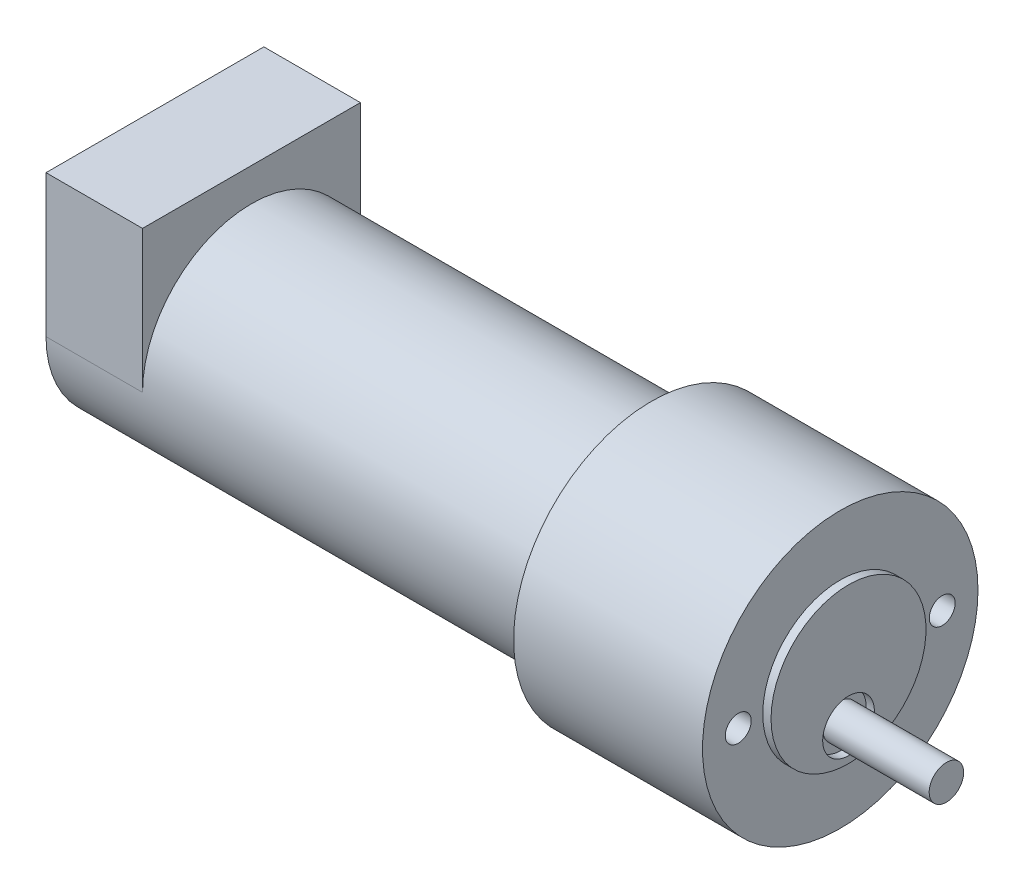
ISO-10303-21;
HEADER;
FILE_DESCRIPTION(('STEP AP214'),'2;1');
FILE_NAME('part.step','',(''),(''),'','','');
FILE_SCHEMA(('AUTOMOTIVE_DESIGN { 1 0 10303 214 1 1 1 1 }'));
ENDSEC;
DATA;
#1=APPLICATION_CONTEXT('core data for automotive mechanical design processes');
#2=APPLICATION_PROTOCOL_DEFINITION('international standard','automotive_design',2000,#1);
#3=PRODUCT_CONTEXT('',#1,'mechanical');
#4=PRODUCT('Part','Part','',(#3));
#5=PRODUCT_RELATED_PRODUCT_CATEGORY('part','',(#4));
#6=PRODUCT_DEFINITION_FORMATION('','',#4);
#7=PRODUCT_DEFINITION_CONTEXT('part definition',#1,'design');
#8=PRODUCT_DEFINITION('design','',#6,#7);
#9=PRODUCT_DEFINITION_SHAPE('','',#8);
#10=(LENGTH_UNIT() NAMED_UNIT(*) SI_UNIT(.MILLI.,.METRE.));
#11=(NAMED_UNIT(*) PLANE_ANGLE_UNIT() SI_UNIT($,.RADIAN.));
#12=(NAMED_UNIT(*) SI_UNIT($,.STERADIAN.) SOLID_ANGLE_UNIT());
#13=UNCERTAINTY_MEASURE_WITH_UNIT(LENGTH_MEASURE(1.E-05),#10,'distance_accuracy_value','');
#14=(GEOMETRIC_REPRESENTATION_CONTEXT(3) GLOBAL_UNCERTAINTY_ASSIGNED_CONTEXT((#13)) GLOBAL_UNIT_ASSIGNED_CONTEXT((#10,
#11,#12)) REPRESENTATION_CONTEXT('',''));
#15=CARTESIAN_POINT('',(0.,0.,0.));
#16=DIRECTION('',(0.,0.,1.));
#17=DIRECTION('',(1.,0.,0.));
#18=AXIS2_PLACEMENT_3D('',#15,#16,#17);
#19=CARTESIAN_POINT('',(126.238,0.,0.));
#20=DIRECTION('',(1.,0.,0.));
#21=DIRECTION('',(0.,0.,-1.));
#22=AXIS2_PLACEMENT_3D('',#19,#20,#21);
#23=PLANE('',#22);
#24=CARTESIAN_POINT('',(126.238,-8.2296,0.));
#25=DIRECTION('',(1.,0.,0.));
#26=DIRECTION('',(0.,0.,-1.));
#27=AXIS2_PLACEMENT_3D('',#24,#25,#26);
#28=CIRCLE('',#27,4.7625);
#29=CARTESIAN_POINT('',(126.238,-8.2296,4.7625));
#30=VERTEX_POINT('',#29);
#31=EDGE_CURVE('E11',#30,#30,#28,.F.);
#32=ORIENTED_EDGE('',*,*,#31,.F.);
#33=EDGE_LOOP('',(#32));
#34=FACE_BOUND('',#33,.T.);
#35=CARTESIAN_POINT('',(126.238,-8.2296,0.));
#36=DIRECTION('',(1.,0.,0.));
#37=DIRECTION('',(0.,0.,-1.));
#38=AXIS2_PLACEMENT_3D('',#35,#36,#37);
#39=CIRCLE('',#38,3.175);
#40=CARTESIAN_POINT('',(126.238,-8.2296,-3.175));
#41=VERTEX_POINT('',#40);
#42=EDGE_CURVE('E311',#41,#41,#39,.T.);
#43=ORIENTED_EDGE('',*,*,#42,.F.);
#44=EDGE_LOOP('',(#43));
#45=FACE_BOUND('',#44,.T.);
#46=ADVANCED_FACE('F32',(#34,#45),#23,.T.);
#47=CARTESIAN_POINT('',(126.238,0.,18.7833));
#48=DIRECTION('',(1.,0.,0.));
#49=DIRECTION('',(0.,0.,1.));
#50=AXIS2_PLACEMENT_3D('',#47,#48,#49);
#51=CIRCLE('',#50,2.3876);
#52=CARTESIAN_POINT('',(126.238,0.,21.1709));
#53=VERTEX_POINT('',#52);
#54=EDGE_CURVE('E302',#53,#53,#51,.T.);
#55=ORIENTED_EDGE('',*,*,#54,.F.);
#56=EDGE_LOOP('',(#55));
#57=FACE_BOUND('',#56,.T.);
#58=CARTESIAN_POINT('',(126.238,0.,-18.7833));
#59=DIRECTION('',(1.,0.,0.));
#60=DIRECTION('',(0.,0.,-1.));
#61=AXIS2_PLACEMENT_3D('',#58,#59,#60);
#62=CIRCLE('',#61,2.3876);
#63=CARTESIAN_POINT('',(126.238,0.,-21.1709));
#64=VERTEX_POINT('',#63);
#65=EDGE_CURVE('E301',#64,#64,#62,.T.);
#66=ORIENTED_EDGE('',*,*,#65,.F.);
#67=EDGE_LOOP('',(#66));
#68=FACE_BOUND('',#67,.T.);
#69=CARTESIAN_POINT('',(126.238,0.,0.));
#70=DIRECTION('',(1.,0.,0.));
#71=DIRECTION('',(0.,0.,-1.));
#72=AXIS2_PLACEMENT_3D('',#69,#70,#71);
#73=CIRCLE('',#72,25.3746);
#74=CARTESIAN_POINT('',(126.238,0.,-25.3746));
#75=VERTEX_POINT('',#74);
#76=EDGE_CURVE('E104',#75,#75,#73,.T.);
#77=ORIENTED_EDGE('',*,*,#76,.T.);
#78=EDGE_LOOP('',(#77));
#79=FACE_BOUND('',#78,.T.);
#80=CARTESIAN_POINT('',(126.238,0.,0.));
#81=DIRECTION('',(1.,0.,0.));
#82=DIRECTION('',(0.,0.,-1.));
#83=AXIS2_PLACEMENT_3D('',#80,#81,#82);
#84=CIRCLE('',#83,14.2748);
#85=CARTESIAN_POINT('',(126.238,0.,14.2748));
#86=VERTEX_POINT('',#85);
#87=EDGE_CURVE('E321',#86,#86,#84,.T.);
#88=ORIENTED_EDGE('',*,*,#87,.F.);
#89=EDGE_LOOP('',(#88));
#90=FACE_BOUND('',#89,.T.);
#91=ADVANCED_FACE('F125',(#57,#68,#79,#90),#23,.T.);
#92=CARTESIAN_POINT('',(91.44,0.,0.));
#93=DIRECTION('',(-1.,0.,0.));
#94=DIRECTION('',(0.,0.,1.));
#95=AXIS2_PLACEMENT_3D('',#92,#93,#94);
#96=CYLINDRICAL_SURFACE('',#95,20.066);
#97=CARTESIAN_POINT('',(17.78,0.,0.));
#98=DIRECTION('',(1.,0.,0.));
#99=DIRECTION('',(0.,0.,-1.));
#100=AXIS2_PLACEMENT_3D('',#97,#98,#99);
#101=CIRCLE('',#100,20.066);
#102=CARTESIAN_POINT('',(17.78,0.,-20.066));
#103=VERTEX_POINT('',#102);
#104=CARTESIAN_POINT('',(17.78,0.,20.066));
#105=VERTEX_POINT('',#104);
#106=EDGE_CURVE('E40',#103,#105,#101,.T.);
#107=ORIENTED_EDGE('',*,*,#106,.T.);
#108=DIRECTION('',(-1.,0.,0.));
#109=VECTOR('',#108,1.);
#110=CARTESIAN_POINT('',(17.78,0.,20.066));
#111=LINE('',#110,#109);
#112=CARTESIAN_POINT('',(0.,0.,20.066));
#113=VERTEX_POINT('',#112);
#114=EDGE_CURVE('E83',#105,#113,#111,.T.);
#115=ORIENTED_EDGE('',*,*,#114,.T.);
#116=CARTESIAN_POINT('',(0.,0.,0.));
#117=DIRECTION('',(1.,0.,0.));
#118=DIRECTION('',(0.,0.,-1.));
#119=AXIS2_PLACEMENT_3D('',#116,#117,#118);
#120=CIRCLE('',#119,20.066);
#121=CARTESIAN_POINT('',(0.,0.,-20.066));
#122=VERTEX_POINT('',#121);
#123=EDGE_CURVE('E107',#113,#122,#120,.T.);
#124=ORIENTED_EDGE('',*,*,#123,.T.);
#125=DIRECTION('',(-1.,0.,0.));
#126=VECTOR('',#125,1.);
#127=CARTESIAN_POINT('',(17.78,0.,-20.066));
#128=LINE('',#127,#126);
#129=EDGE_CURVE('E47',#103,#122,#128,.T.);
#130=ORIENTED_EDGE('',*,*,#129,.F.);
#131=EDGE_LOOP('',(#107,#115,#124,#130));
#132=FACE_BOUND('',#131,.T.);
#133=CARTESIAN_POINT('',(91.44,0.,0.));
#134=DIRECTION('',(1.,0.,0.));
#135=DIRECTION('',(0.,0.,-1.));
#136=AXIS2_PLACEMENT_3D('',#133,#134,#135);
#137=CIRCLE('',#136,20.066);
#138=CARTESIAN_POINT('',(91.44,0.,-20.066));
#139=VERTEX_POINT('',#138);
#140=EDGE_CURVE('E110',#139,#139,#137,.T.);
#141=ORIENTED_EDGE('',*,*,#140,.F.);
#142=EDGE_LOOP('',(#141));
#143=FACE_BOUND('',#142,.T.);
#144=ADVANCED_FACE('F34',(#132,#143),#96,.T.);
#145=CARTESIAN_POINT('',(0.,0.,0.));
#146=DIRECTION('',(1.,0.,0.));
#147=DIRECTION('',(0.,0.,-1.));
#148=AXIS2_PLACEMENT_3D('',#145,#146,#147);
#149=PLANE('',#148);
#150=ORIENTED_EDGE('',*,*,#123,.F.);
#151=DIRECTION('',(0.,1.,0.));
#152=VECTOR('',#151,1.);
#153=CARTESIAN_POINT('',(0.,26.162,20.066));
#154=LINE('',#153,#152);
#155=CARTESIAN_POINT('',(0.,26.162,20.066));
#156=VERTEX_POINT('',#155);
#157=EDGE_CURVE('E102',#113,#156,#154,.T.);
#158=ORIENTED_EDGE('',*,*,#157,.T.);
#159=DIRECTION('',(0.,0.,-1.));
#160=VECTOR('',#159,1.);
#161=CARTESIAN_POINT('',(0.,26.162,-20.066));
#162=LINE('',#161,#160);
#163=CARTESIAN_POINT('',(0.,26.162,-20.066));
#164=VERTEX_POINT('',#163);
#165=EDGE_CURVE('E77',#156,#164,#162,.T.);
#166=ORIENTED_EDGE('',*,*,#165,.T.);
#167=DIRECTION('',(0.,-1.,0.));
#168=VECTOR('',#167,1.);
#169=CARTESIAN_POINT('',(0.,26.162,-20.066));
#170=LINE('',#169,#168);
#171=EDGE_CURVE('E93',#164,#122,#170,.T.);
#172=ORIENTED_EDGE('',*,*,#171,.T.);
#173=EDGE_LOOP('',(#150,#158,#166,#172));
#174=FACE_BOUND('',#173,.T.);
#175=ADVANCED_FACE('F118',(#174),#149,.F.);
#176=CARTESIAN_POINT('',(17.78,0.,0.));
#177=DIRECTION('',(1.,0.,0.));
#178=DIRECTION('',(0.,0.,-1.));
#179=AXIS2_PLACEMENT_3D('',#176,#177,#178);
#180=PLANE('',#179);
#181=ORIENTED_EDGE('',*,*,#106,.F.);
#182=DIRECTION('',(0.,-1.,0.));
#183=VECTOR('',#182,1.);
#184=CARTESIAN_POINT('',(17.78,26.162,-20.066));
#185=LINE('',#184,#183);
#186=CARTESIAN_POINT('',(17.78,26.162,-20.066));
#187=VERTEX_POINT('',#186);
#188=EDGE_CURVE('E90',#187,#103,#185,.T.);
#189=ORIENTED_EDGE('',*,*,#188,.F.);
#190=DIRECTION('',(0.,0.,-1.));
#191=VECTOR('',#190,1.);
#192=CARTESIAN_POINT('',(17.78,26.162,-20.066));
#193=LINE('',#192,#191);
#194=CARTESIAN_POINT('',(17.78,26.162,20.066));
#195=VERTEX_POINT('',#194);
#196=EDGE_CURVE('E74',#195,#187,#193,.T.);
#197=ORIENTED_EDGE('',*,*,#196,.F.);
#198=DIRECTION('',(0.,1.,0.));
#199=VECTOR('',#198,1.);
#200=CARTESIAN_POINT('',(17.78,26.162,20.066));
#201=LINE('',#200,#199);
#202=EDGE_CURVE('E88',#105,#195,#201,.T.);
#203=ORIENTED_EDGE('',*,*,#202,.F.);
#204=EDGE_LOOP('',(#181,#189,#197,#203));
#205=FACE_BOUND('',#204,.T.);
#206=ADVANCED_FACE('F87',(#205),#180,.T.);
#207=CARTESIAN_POINT('',(17.78,26.162,-20.066));
#208=DIRECTION('',(0.,0.,-1.));
#209=DIRECTION('',(-1.,0.,0.));
#210=AXIS2_PLACEMENT_3D('',#207,#208,#209);
#211=PLANE('',#210);
#212=ORIENTED_EDGE('',*,*,#171,.F.);
#213=DIRECTION('',(-1.,0.,0.));
#214=VECTOR('',#213,1.);
#215=CARTESIAN_POINT('',(17.78,26.162,-20.066));
#216=LINE('',#215,#214);
#217=EDGE_CURVE('E82',#187,#164,#216,.T.);
#218=ORIENTED_EDGE('',*,*,#217,.F.);
#219=ORIENTED_EDGE('',*,*,#188,.T.);
#220=ORIENTED_EDGE('',*,*,#129,.T.);
#221=EDGE_LOOP('',(#212,#218,#219,#220));
#222=FACE_BOUND('',#221,.T.);
#223=ADVANCED_FACE('F117',(#222),#211,.T.);
#224=CARTESIAN_POINT('',(17.78,26.162,-20.066));
#225=DIRECTION('',(0.,1.,0.));
#226=DIRECTION('',(0.,0.,1.));
#227=AXIS2_PLACEMENT_3D('',#224,#225,#226);
#228=PLANE('',#227);
#229=ORIENTED_EDGE('',*,*,#165,.F.);
#230=DIRECTION('',(-1.,0.,0.));
#231=VECTOR('',#230,1.);
#232=CARTESIAN_POINT('',(17.78,26.162,20.066));
#233=LINE('',#232,#231);
#234=EDGE_CURVE('E71',#195,#156,#233,.T.);
#235=ORIENTED_EDGE('',*,*,#234,.F.);
#236=ORIENTED_EDGE('',*,*,#196,.T.);
#237=ORIENTED_EDGE('',*,*,#217,.T.);
#238=EDGE_LOOP('',(#229,#235,#236,#237));
#239=FACE_BOUND('',#238,.T.);
#240=ADVANCED_FACE('F73',(#239),#228,.T.);
#241=CARTESIAN_POINT('',(17.78,26.162,20.066));
#242=DIRECTION('',(0.,0.,1.));
#243=DIRECTION('',(0.,-1.,0.));
#244=AXIS2_PLACEMENT_3D('',#241,#242,#243);
#245=PLANE('',#244);
#246=ORIENTED_EDGE('',*,*,#157,.F.);
#247=ORIENTED_EDGE('',*,*,#114,.F.);
#248=ORIENTED_EDGE('',*,*,#202,.T.);
#249=ORIENTED_EDGE('',*,*,#234,.T.);
#250=EDGE_LOOP('',(#246,#247,#248,#249));
#251=FACE_BOUND('',#250,.T.);
#252=ADVANCED_FACE('F92',(#251),#245,.T.);
#253=CARTESIAN_POINT('',(91.44,0.,0.));
#254=DIRECTION('',(1.,0.,0.));
#255=DIRECTION('',(0.,0.,-1.));
#256=AXIS2_PLACEMENT_3D('',#253,#254,#255);
#257=PLANE('',#256);
#258=CARTESIAN_POINT('',(91.44,0.,0.));
#259=DIRECTION('',(1.,0.,0.));
#260=DIRECTION('',(0.,0.,-1.));
#261=AXIS2_PLACEMENT_3D('',#258,#259,#260);
#262=CIRCLE('',#261,25.3746);
#263=CARTESIAN_POINT('',(91.44,0.,-25.3746));
#264=VERTEX_POINT('',#263);
#265=EDGE_CURVE('E98',#264,#264,#262,.T.);
#266=ORIENTED_EDGE('',*,*,#265,.F.);
#267=EDGE_LOOP('',(#266));
#268=FACE_BOUND('',#267,.T.);
#269=ORIENTED_EDGE('',*,*,#140,.T.);
#270=EDGE_LOOP('',(#269));
#271=FACE_BOUND('',#270,.T.);
#272=ADVANCED_FACE('F140',(#268,#271),#257,.F.);
#273=CARTESIAN_POINT('',(126.238,0.,0.));
#274=DIRECTION('',(-1.,0.,0.));
#275=DIRECTION('',(0.,0.,1.));
#276=AXIS2_PLACEMENT_3D('',#273,#274,#275);
#277=CYLINDRICAL_SURFACE('',#276,25.3746);
#278=ORIENTED_EDGE('',*,*,#76,.F.);
#279=EDGE_LOOP('',(#278));
#280=FACE_BOUND('',#279,.T.);
#281=ORIENTED_EDGE('',*,*,#265,.T.);
#282=EDGE_LOOP('',(#281));
#283=FACE_BOUND('',#282,.T.);
#284=ADVANCED_FACE('F143',(#280,#283),#277,.T.);
#285=CARTESIAN_POINT('',(127.762,0.,0.));
#286=DIRECTION('',(1.,0.,0.));
#287=DIRECTION('',(0.,0.,-1.));
#288=AXIS2_PLACEMENT_3D('',#285,#286,#287);
#289=PLANE('',#288);
#290=CARTESIAN_POINT('',(127.762,0.,0.));
#291=DIRECTION('',(1.,0.,0.));
#292=DIRECTION('',(0.,0.,-1.));
#293=AXIS2_PLACEMENT_3D('',#290,#291,#292);
#294=CIRCLE('',#293,14.2748);
#295=CARTESIAN_POINT('',(127.762,0.,14.2748));
#296=VERTEX_POINT('',#295);
#297=EDGE_CURVE('E322',#296,#296,#294,.T.);
#298=ORIENTED_EDGE('',*,*,#297,.T.);
#299=EDGE_LOOP('',(#298));
#300=FACE_BOUND('',#299,.T.);
#301=CARTESIAN_POINT('',(127.762,-8.2296,0.));
#302=DIRECTION('',(1.,0.,0.));
#303=DIRECTION('',(0.,0.,-1.));
#304=AXIS2_PLACEMENT_3D('',#301,#302,#303);
#305=CIRCLE('',#304,4.7625);
#306=CARTESIAN_POINT('',(127.762,-8.2296,4.7625));
#307=VERTEX_POINT('',#306);
#308=EDGE_CURVE('E316',#307,#307,#305,.T.);
#309=ORIENTED_EDGE('',*,*,#308,.F.);
#310=EDGE_LOOP('',(#309));
#311=FACE_BOUND('',#310,.T.);
#312=ADVANCED_FACE('F146',(#300,#311),#289,.T.);
#313=CARTESIAN_POINT('',(127.762,0.,0.));
#314=DIRECTION('',(-1.,0.,0.));
#315=DIRECTION('',(0.,0.,1.));
#316=AXIS2_PLACEMENT_3D('',#313,#314,#315);
#317=CYLINDRICAL_SURFACE('',#316,14.2748);
#318=CARTESIAN_POINT('',(127.762,0.,14.2748));
#319=CARTESIAN_POINT('',(127.746125,0.,14.2748));
#320=CARTESIAN_POINT('',(127.73025,0.,14.2748));
#321=CARTESIAN_POINT('',(127.6985,0.,14.2748));
#322=CARTESIAN_POINT('',(127.682625,0.,14.2748));
#323=CARTESIAN_POINT('',(127.650875,0.,14.2748));
#324=CARTESIAN_POINT('',(127.635,0.,14.2748));
#325=CARTESIAN_POINT('',(127.60325,0.,14.2748));
#326=CARTESIAN_POINT('',(127.587375,0.,14.2748));
#327=CARTESIAN_POINT('',(127.555625,0.,14.2748));
#328=CARTESIAN_POINT('',(127.53975,0.,14.2748));
#329=CARTESIAN_POINT('',(127.508,0.,14.2748));
#330=CARTESIAN_POINT('',(127.492125,0.,14.2748));
#331=CARTESIAN_POINT('',(127.460375,0.,14.2748));
#332=CARTESIAN_POINT('',(127.4445,0.,14.2748));
#333=CARTESIAN_POINT('',(127.41275,0.,14.2748));
#334=CARTESIAN_POINT('',(127.396875,0.,14.2748));
#335=CARTESIAN_POINT('',(127.365125,0.,14.2748));
#336=CARTESIAN_POINT('',(127.34925,0.,14.2748));
#337=CARTESIAN_POINT('',(127.3175,0.,14.2748));
#338=CARTESIAN_POINT('',(127.301625,0.,14.2748));
#339=CARTESIAN_POINT('',(127.269875,0.,14.2748));
#340=CARTESIAN_POINT('',(127.254,0.,14.2748));
#341=CARTESIAN_POINT('',(127.22225,0.,14.2748));
#342=CARTESIAN_POINT('',(127.206375,0.,14.2748));
#343=CARTESIAN_POINT('',(127.174625,0.,14.2748));
#344=CARTESIAN_POINT('',(127.15875,0.,14.2748));
#345=CARTESIAN_POINT('',(127.127,0.,14.2748));
#346=CARTESIAN_POINT('',(127.111125,0.,14.2748));
#347=CARTESIAN_POINT('',(127.079375,0.,14.2748));
#348=CARTESIAN_POINT('',(127.0635,0.,14.2748));
#349=CARTESIAN_POINT('',(127.03175,0.,14.2748));
#350=CARTESIAN_POINT('',(127.015875,0.,14.2748));
#351=CARTESIAN_POINT('',(126.984125,0.,14.2748));
#352=CARTESIAN_POINT('',(126.96825,0.,14.2748));
#353=CARTESIAN_POINT('',(126.9365,0.,14.2748));
#354=CARTESIAN_POINT('',(126.920625,0.,14.2748));
#355=CARTESIAN_POINT('',(126.888875,0.,14.2748));
#356=CARTESIAN_POINT('',(126.873,0.,14.2748));
#357=CARTESIAN_POINT('',(126.84125,0.,14.2748));
#358=CARTESIAN_POINT('',(126.825375,0.,14.2748));
#359=CARTESIAN_POINT('',(126.793625,0.,14.2748));
#360=CARTESIAN_POINT('',(126.77775,0.,14.2748));
#361=CARTESIAN_POINT('',(126.746,0.,14.2748));
#362=CARTESIAN_POINT('',(126.730125,0.,14.2748));
#363=CARTESIAN_POINT('',(126.698375,0.,14.2748));
#364=CARTESIAN_POINT('',(126.6825,0.,14.2748));
#365=CARTESIAN_POINT('',(126.65075,0.,14.2748));
#366=CARTESIAN_POINT('',(126.634875,0.,14.2748));
#367=CARTESIAN_POINT('',(126.603125,0.,14.2748));
#368=CARTESIAN_POINT('',(126.58725,0.,14.2748));
#369=CARTESIAN_POINT('',(126.5555,0.,14.2748));
#370=CARTESIAN_POINT('',(126.539625,0.,14.2748));
#371=CARTESIAN_POINT('',(126.507875,0.,14.2748));
#372=CARTESIAN_POINT('',(126.492,0.,14.2748));
#373=CARTESIAN_POINT('',(126.46025,0.,14.2748));
#374=CARTESIAN_POINT('',(126.444375,0.,14.2748));
#375=CARTESIAN_POINT('',(126.412625,0.,14.2748));
#376=CARTESIAN_POINT('',(126.39675,0.,14.2748));
#377=CARTESIAN_POINT('',(126.365,0.,14.2748));
#378=CARTESIAN_POINT('',(126.349125,0.,14.2748));
#379=CARTESIAN_POINT('',(126.317375,0.,14.2748));
#380=CARTESIAN_POINT('',(126.3015,0.,14.2748));
#381=CARTESIAN_POINT('',(126.26975,0.,14.2748));
#382=CARTESIAN_POINT('',(126.253875,0.,14.2748));
#383=CARTESIAN_POINT('',(126.238,0.,14.2748));
#384=B_SPLINE_CURVE_WITH_KNOTS('',3,(#318,#319,#320,#321,#322,#323,#324,#325,#326,#327,#328,
#329,#330,#331,#332,#333,#334,#335,#336,#337,#338,#339,#340,#341,#342,#343,#344,#345,#346,#347,
#348,#349,#350,#351,#352,#353,#354,#355,#356,#357,#358,#359,#360,#361,#362,#363,#364,#365,#366,
#367,#368,#369,#370,#371,#372,#373,#374,#375,#376,#377,#378,#379,#380,#381,#382,#383),
.UNSPECIFIED.,.F.,.F.,(4,2,2,2,2,2,2,2,2,2,2,2,2,2,2,2,2,2,2,2,2,2,2,2,2,2,2,2,2,2,2,2,4),(0.,
0.0476250000000233,0.0952500000000189,0.142875000000015,0.19050000000001,0.238125000000006,
0.285750000000001,0.333375000000025,0.38100000000002,0.428625000000016,0.476250000000011,
0.523875000000007,0.571500000000003,0.619125000000026,0.666750000000021,0.714375000000017,
0.762000000000013,0.809625000000008,0.857250000000004,0.904874999999999,0.952500000000023,
1.00012500000002,1.04775000000001,1.09537500000001,1.14300000000001,1.190625,1.23825000000002,
1.28587500000002,1.33350000000002,1.38112500000001,1.42875000000001,1.476375,1.524),.UNSPECIFIED.);
#385=EDGE_CURVE('BSEAM138',#296,#86,#384,.T.);
#386=ORIENTED_EDGE('',*,*,#297,.F.);
#387=ORIENTED_EDGE('',*,*,#87,.T.);
#388=ORIENTED_EDGE('',*,*,#385,.T.);
#389=ORIENTED_EDGE('',*,*,#385,.F.);
#390=EDGE_LOOP('',(#386,#388,#387,#389));
#391=FACE_BOUND('',#390,.T.);
#392=ADVANCED_FACE('F138',(#391),#317,.T.);
#393=CARTESIAN_POINT('',(127.762,-8.2296,0.));
#394=DIRECTION('',(-1.,0.,0.));
#395=DIRECTION('',(0.,0.,1.));
#396=AXIS2_PLACEMENT_3D('',#393,#394,#395);
#397=CYLINDRICAL_SURFACE('',#396,4.7625);
#398=CARTESIAN_POINT('',(127.762,-8.2296,4.7625));
#399=CARTESIAN_POINT('',(127.746125,-8.2296,4.7625));
#400=CARTESIAN_POINT('',(127.73025,-8.2296,4.7625));
#401=CARTESIAN_POINT('',(127.6985,-8.2296,4.7625));
#402=CARTESIAN_POINT('',(127.682625,-8.2296,4.7625));
#403=CARTESIAN_POINT('',(127.650875,-8.2296,4.7625));
#404=CARTESIAN_POINT('',(127.635,-8.2296,4.7625));
#405=CARTESIAN_POINT('',(127.60325,-8.2296,4.7625));
#406=CARTESIAN_POINT('',(127.587375,-8.2296,4.7625));
#407=CARTESIAN_POINT('',(127.555625,-8.2296,4.7625));
#408=CARTESIAN_POINT('',(127.53975,-8.2296,4.7625));
#409=CARTESIAN_POINT('',(127.508,-8.2296,4.7625));
#410=CARTESIAN_POINT('',(127.492125,-8.2296,4.7625));
#411=CARTESIAN_POINT('',(127.460375,-8.2296,4.7625));
#412=CARTESIAN_POINT('',(127.4445,-8.2296,4.7625));
#413=CARTESIAN_POINT('',(127.41275,-8.2296,4.7625));
#414=CARTESIAN_POINT('',(127.396875,-8.2296,4.7625));
#415=CARTESIAN_POINT('',(127.365125,-8.2296,4.7625));
#416=CARTESIAN_POINT('',(127.34925,-8.2296,4.7625));
#417=CARTESIAN_POINT('',(127.3175,-8.2296,4.7625));
#418=CARTESIAN_POINT('',(127.301625,-8.2296,4.7625));
#419=CARTESIAN_POINT('',(127.269875,-8.2296,4.7625));
#420=CARTESIAN_POINT('',(127.254,-8.2296,4.7625));
#421=CARTESIAN_POINT('',(127.22225,-8.2296,4.7625));
#422=CARTESIAN_POINT('',(127.206375,-8.2296,4.7625));
#423=CARTESIAN_POINT('',(127.174625,-8.2296,4.7625));
#424=CARTESIAN_POINT('',(127.15875,-8.2296,4.7625));
#425=CARTESIAN_POINT('',(127.127,-8.2296,4.7625));
#426=CARTESIAN_POINT('',(127.111125,-8.2296,4.7625));
#427=CARTESIAN_POINT('',(127.079375,-8.2296,4.7625));
#428=CARTESIAN_POINT('',(127.0635,-8.2296,4.7625));
#429=CARTESIAN_POINT('',(127.03175,-8.2296,4.7625));
#430=CARTESIAN_POINT('',(127.015875,-8.2296,4.7625));
#431=CARTESIAN_POINT('',(126.984125,-8.2296,4.7625));
#432=CARTESIAN_POINT('',(126.96825,-8.2296,4.7625));
#433=CARTESIAN_POINT('',(126.9365,-8.2296,4.7625));
#434=CARTESIAN_POINT('',(126.920625,-8.2296,4.7625));
#435=CARTESIAN_POINT('',(126.888875,-8.2296,4.7625));
#436=CARTESIAN_POINT('',(126.873,-8.2296,4.7625));
#437=CARTESIAN_POINT('',(126.84125,-8.2296,4.7625));
#438=CARTESIAN_POINT('',(126.825375,-8.2296,4.7625));
#439=CARTESIAN_POINT('',(126.793625,-8.2296,4.7625));
#440=CARTESIAN_POINT('',(126.77775,-8.2296,4.7625));
#441=CARTESIAN_POINT('',(126.746,-8.2296,4.7625));
#442=CARTESIAN_POINT('',(126.730125,-8.2296,4.7625));
#443=CARTESIAN_POINT('',(126.698375,-8.2296,4.7625));
#444=CARTESIAN_POINT('',(126.6825,-8.2296,4.7625));
#445=CARTESIAN_POINT('',(126.65075,-8.2296,4.7625));
#446=CARTESIAN_POINT('',(126.634875,-8.2296,4.7625));
#447=CARTESIAN_POINT('',(126.603125,-8.2296,4.7625));
#448=CARTESIAN_POINT('',(126.58725,-8.2296,4.7625));
#449=CARTESIAN_POINT('',(126.5555,-8.2296,4.7625));
#450=CARTESIAN_POINT('',(126.539625,-8.2296,4.7625));
#451=CARTESIAN_POINT('',(126.507875,-8.2296,4.7625));
#452=CARTESIAN_POINT('',(126.492,-8.2296,4.7625));
#453=CARTESIAN_POINT('',(126.46025,-8.2296,4.7625));
#454=CARTESIAN_POINT('',(126.444375,-8.2296,4.7625));
#455=CARTESIAN_POINT('',(126.412625,-8.2296,4.7625));
#456=CARTESIAN_POINT('',(126.39675,-8.2296,4.7625));
#457=CARTESIAN_POINT('',(126.365,-8.2296,4.7625));
#458=CARTESIAN_POINT('',(126.349125,-8.2296,4.7625));
#459=CARTESIAN_POINT('',(126.317375,-8.2296,4.7625));
#460=CARTESIAN_POINT('',(126.3015,-8.2296,4.7625));
#461=CARTESIAN_POINT('',(126.26975,-8.2296,4.7625));
#462=CARTESIAN_POINT('',(126.253875,-8.2296,4.7625));
#463=CARTESIAN_POINT('',(126.238,-8.2296,4.7625));
#464=B_SPLINE_CURVE_WITH_KNOTS('',3,(#398,#399,#400,#401,#402,#403,#404,#405,#406,#407,#408,
#409,#410,#411,#412,#413,#414,#415,#416,#417,#418,#419,#420,#421,#422,#423,#424,#425,#426,#427,
#428,#429,#430,#431,#432,#433,#434,#435,#436,#437,#438,#439,#440,#441,#442,#443,#444,#445,#446,
#447,#448,#449,#450,#451,#452,#453,#454,#455,#456,#457,#458,#459,#460,#461,#462,#463),
.UNSPECIFIED.,.F.,.F.,(4,2,2,2,2,2,2,2,2,2,2,2,2,2,2,2,2,2,2,2,2,2,2,2,2,2,2,2,2,2,2,2,4),(0.,
0.0476249999999956,0.0952499999999912,0.142874999999987,0.190499999999982,0.238124999999978,
0.285749999999974,0.333374999999997,0.380999999999992,0.428624999999988,0.476249999999984,
0.523874999999979,0.571499999999975,0.619124999999998,0.666749999999994,0.714374999999989,
0.761999999999985,0.80962499999998,0.857249999999976,0.904874999999972,0.952499999999995,
1.00012499999999,1.04774999999999,1.09537499999998,1.14299999999998,1.19062499999997,1.23825,
1.28587499999999,1.33349999999999,1.38112499999998,1.42874999999998,1.47637499999997,
1.52399999999997),.UNSPECIFIED.);
#465=EDGE_CURVE('BSEAM177',#307,#30,#464,.T.);
#466=ORIENTED_EDGE('',*,*,#308,.T.);
#467=ORIENTED_EDGE('',*,*,#31,.T.);
#468=ORIENTED_EDGE('',*,*,#465,.T.);
#469=ORIENTED_EDGE('',*,*,#465,.F.);
#470=EDGE_LOOP('',(#466,#468,#467,#469));
#471=FACE_BOUND('',#470,.T.);
#472=ADVANCED_FACE('F177',(#471),#397,.F.);
#473=CARTESIAN_POINT('',(145.796,-8.2296,0.));
#474=DIRECTION('',(-1.,0.,0.));
#475=DIRECTION('',(0.,0.,1.));
#476=AXIS2_PLACEMENT_3D('',#473,#474,#475);
#477=CYLINDRICAL_SURFACE('',#476,3.175);
#478=CARTESIAN_POINT('',(145.796,-8.2296,0.));
#479=DIRECTION('',(1.,0.,0.));
#480=DIRECTION('',(0.,0.,-1.));
#481=AXIS2_PLACEMENT_3D('',#478,#479,#480);
#482=CIRCLE('',#481,3.175);
#483=CARTESIAN_POINT('',(145.796,-8.2296,-3.175));
#484=VERTEX_POINT('',#483);
#485=EDGE_CURVE('E313',#484,#484,#482,.T.);
#486=ORIENTED_EDGE('',*,*,#485,.F.);
#487=EDGE_LOOP('',(#486));
#488=FACE_BOUND('',#487,.T.);
#489=ORIENTED_EDGE('',*,*,#42,.T.);
#490=EDGE_LOOP('',(#489));
#491=FACE_BOUND('',#490,.T.);
#492=ADVANCED_FACE('F184',(#488,#491),#477,.T.);
#493=CARTESIAN_POINT('',(145.796,-8.2296,0.));
#494=DIRECTION('',(1.,0.,0.));
#495=DIRECTION('',(0.,0.,-1.));
#496=AXIS2_PLACEMENT_3D('',#493,#494,#495);
#497=PLANE('',#496);
#498=ORIENTED_EDGE('',*,*,#485,.T.);
#499=EDGE_LOOP('',(#498));
#500=FACE_BOUND('',#499,.T.);
#501=ADVANCED_FACE('F192',(#500),#497,.T.);
#502=CARTESIAN_POINT('',(113.538,0.,-18.7833));
#503=DIRECTION('',(1.,0.,0.));
#504=DIRECTION('',(0.,0.,-1.));
#505=AXIS2_PLACEMENT_3D('',#502,#503,#504);
#506=CYLINDRICAL_SURFACE('',#505,2.3876);
#507=CARTESIAN_POINT('',(113.538,0.,-18.7833));
#508=DIRECTION('',(1.,0.,0.));
#509=DIRECTION('',(0.,0.,-1.));
#510=AXIS2_PLACEMENT_3D('',#507,#508,#509);
#511=CIRCLE('',#510,2.3876);
#512=CARTESIAN_POINT('',(113.538,0.,-21.1709));
#513=VERTEX_POINT('',#512);
#514=EDGE_CURVE('E305',#513,#513,#511,.T.);
#515=ORIENTED_EDGE('',*,*,#514,.F.);
#516=EDGE_LOOP('',(#515));
#517=FACE_BOUND('',#516,.T.);
#518=ORIENTED_EDGE('',*,*,#65,.T.);
#519=EDGE_LOOP('',(#518));
#520=FACE_BOUND('',#519,.T.);
#521=ADVANCED_FACE('F200',(#517,#520),#506,.F.);
#522=CARTESIAN_POINT('',(113.538,0.,-18.7833));
#523=DIRECTION('',(1.,0.,0.));
#524=DIRECTION('',(0.,0.,-1.));
#525=AXIS2_PLACEMENT_3D('',#522,#523,#524);
#526=PLANE('',#525);
#527=ORIENTED_EDGE('',*,*,#514,.T.);
#528=EDGE_LOOP('',(#527));
#529=FACE_BOUND('',#528,.T.);
#530=ADVANCED_FACE('F209',(#529),#526,.T.);
#531=CARTESIAN_POINT('',(113.538,0.,18.7833));
#532=DIRECTION('',(1.,0.,0.));
#533=DIRECTION('',(0.,0.,-1.));
#534=AXIS2_PLACEMENT_3D('',#531,#532,#533);
#535=CYLINDRICAL_SURFACE('',#534,2.3876);
#536=CARTESIAN_POINT('',(113.538,0.,18.7833));
#537=DIRECTION('',(1.,0.,0.));
#538=DIRECTION('',(0.,0.,1.));
#539=AXIS2_PLACEMENT_3D('',#536,#537,#538);
#540=CIRCLE('',#539,2.3876);
#541=CARTESIAN_POINT('',(113.538,0.,21.1709));
#542=VERTEX_POINT('',#541);
#543=EDGE_CURVE('E300',#542,#542,#540,.T.);
#544=ORIENTED_EDGE('',*,*,#543,.F.);
#545=EDGE_LOOP('',(#544));
#546=FACE_BOUND('',#545,.T.);
#547=ORIENTED_EDGE('',*,*,#54,.T.);
#548=EDGE_LOOP('',(#547));
#549=FACE_BOUND('',#548,.T.);
#550=ADVANCED_FACE('F217',(#546,#549),#535,.F.);
#551=CARTESIAN_POINT('',(113.538,0.,18.7833));
#552=DIRECTION('',(-1.,0.,0.));
#553=DIRECTION('',(0.,0.,1.));
#554=AXIS2_PLACEMENT_3D('',#551,#552,#553);
#555=PLANE('',#554);
#556=ORIENTED_EDGE('',*,*,#543,.T.);
#557=EDGE_LOOP('',(#556));
#558=FACE_BOUND('',#557,.T.);
#559=ADVANCED_FACE('F225',(#558),#555,.F.);
#560=CLOSED_SHELL('',(#46,#91,#144,#175,#206,#223,#240,#252,#272,#284,#312,#392,#472,#492,#501,
#521,#530,#550,#559));
#561=MANIFOLD_SOLID_BREP('B2',#560);
#562=ADVANCED_BREP_SHAPE_REPRESENTATION('',(#18,#561),#14);
#563=SHAPE_DEFINITION_REPRESENTATION(#9,#562);
ENDSEC;
END-ISO-10303-21;
